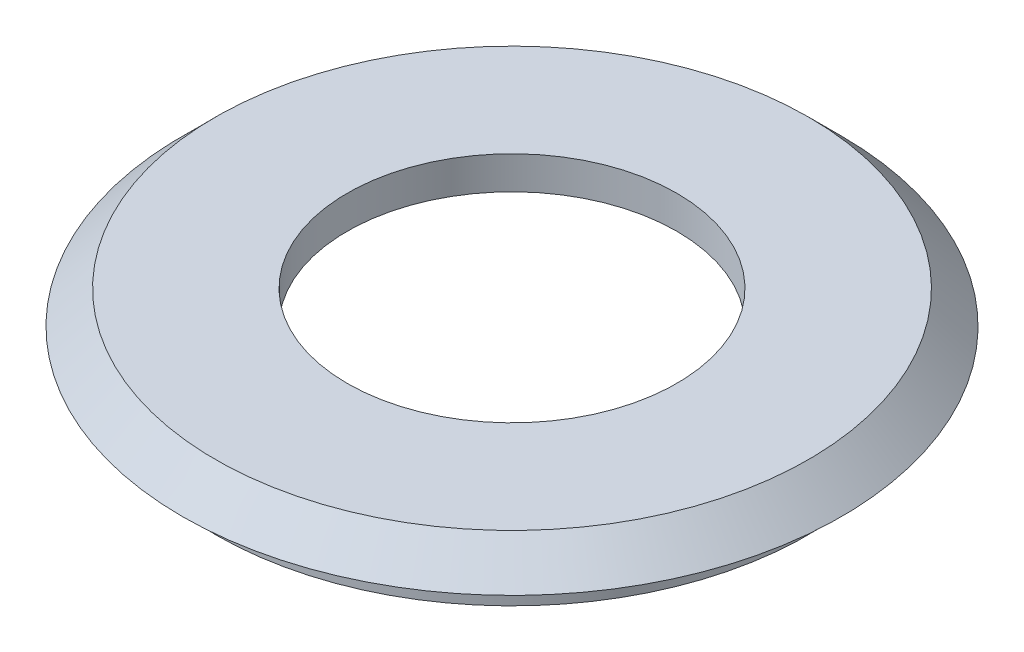
ISO-10303-21;
HEADER;
FILE_DESCRIPTION(('STEP AP214'),'2;1');
FILE_NAME('part.step','',(''),(''),'','','');
FILE_SCHEMA(('AUTOMOTIVE_DESIGN { 1 0 10303 214 1 1 1 1 }'));
ENDSEC;
DATA;
#1=APPLICATION_CONTEXT('core data for automotive mechanical design processes');
#2=APPLICATION_PROTOCOL_DEFINITION('international standard','automotive_design',2000,#1);
#3=PRODUCT_CONTEXT('',#1,'mechanical');
#4=PRODUCT('Part','Part','',(#3));
#5=PRODUCT_RELATED_PRODUCT_CATEGORY('part','',(#4));
#6=PRODUCT_DEFINITION_FORMATION('','',#4);
#7=PRODUCT_DEFINITION_CONTEXT('part definition',#1,'design');
#8=PRODUCT_DEFINITION('design','',#6,#7);
#9=PRODUCT_DEFINITION_SHAPE('','',#8);
#10=(LENGTH_UNIT() NAMED_UNIT(*) SI_UNIT(.MILLI.,.METRE.));
#11=(NAMED_UNIT(*) PLANE_ANGLE_UNIT() SI_UNIT($,.RADIAN.));
#12=(NAMED_UNIT(*) SI_UNIT($,.STERADIAN.) SOLID_ANGLE_UNIT());
#13=UNCERTAINTY_MEASURE_WITH_UNIT(LENGTH_MEASURE(1.E-05),#10,'distance_accuracy_value','');
#14=(GEOMETRIC_REPRESENTATION_CONTEXT(3) GLOBAL_UNCERTAINTY_ASSIGNED_CONTEXT((#13)) GLOBAL_UNIT_ASSIGNED_CONTEXT((#10,
#11,#12)) REPRESENTATION_CONTEXT('',''));
#15=CARTESIAN_POINT('',(0.,0.,0.));
#16=DIRECTION('',(0.,0.,1.));
#17=DIRECTION('',(1.,0.,0.));
#18=AXIS2_PLACEMENT_3D('',#15,#16,#17);
#19=CARTESIAN_POINT('',(0.,10.,0.));
#20=DIRECTION('',(0.,1.,0.));
#21=DIRECTION('',(0.,0.,1.));
#22=AXIS2_PLACEMENT_3D('',#19,#20,#21);
#23=PLANE('',#22);
#24=CARTESIAN_POINT('',(0.,10.,0.));
#25=DIRECTION('',(0.,1.,0.));
#26=DIRECTION('',(0.,0.,1.));
#27=AXIS2_PLACEMENT_3D('',#24,#25,#26);
#28=CIRCLE('',#27,50.);
#29=CARTESIAN_POINT('',(0.,10.,50.));
#30=VERTEX_POINT('',#29);
#31=EDGE_CURVE('E76',#30,#30,#28,.T.);
#32=ORIENTED_EDGE('',*,*,#31,.F.);
#33=EDGE_LOOP('',(#32));
#34=FACE_BOUND('',#33,.T.);
#35=CARTESIAN_POINT('',(0.,10.,0.));
#36=DIRECTION('',(0.,1.,0.));
#37=DIRECTION('',(0.,0.,1.));
#38=AXIS2_PLACEMENT_3D('',#35,#36,#37);
#39=CIRCLE('',#38,90.);
#40=CARTESIAN_POINT('',(0.,10.,-90.));
#41=VERTEX_POINT('',#40);
#42=EDGE_CURVE('E53',#41,#41,#39,.T.);
#43=ORIENTED_EDGE('',*,*,#42,.T.);
#44=EDGE_LOOP('',(#43));
#45=FACE_BOUND('',#44,.T.);
#46=ADVANCED_FACE('F43',(#34,#45),#23,.T.);
#47=CARTESIAN_POINT('',(0.,0.,0.));
#48=DIRECTION('',(0.,1.,0.));
#49=DIRECTION('',(0.,0.,1.));
#50=AXIS2_PLACEMENT_3D('',#47,#48,#49);
#51=PLANE('',#50);
#52=CARTESIAN_POINT('',(0.,0.,0.));
#53=DIRECTION('',(0.,1.,0.));
#54=DIRECTION('',(0.,0.,1.));
#55=AXIS2_PLACEMENT_3D('',#52,#53,#54);
#56=CIRCLE('',#55,89.75);
#57=CARTESIAN_POINT('',(0.,0.,89.75));
#58=VERTEX_POINT('',#57);
#59=EDGE_CURVE('E10',#58,#58,#56,.F.);
#60=ORIENTED_EDGE('',*,*,#59,.F.);
#61=EDGE_LOOP('',(#60));
#62=FACE_BOUND('',#61,.T.);
#63=CARTESIAN_POINT('',(0.,0.,0.));
#64=DIRECTION('',(0.,1.,0.));
#65=DIRECTION('',(0.,0.,1.));
#66=AXIS2_PLACEMENT_3D('',#63,#64,#65);
#67=CIRCLE('',#66,100.);
#68=CARTESIAN_POINT('',(0.,0.,-99.9999999999999));
#69=VERTEX_POINT('',#68);
#70=EDGE_CURVE('E58',#69,#69,#67,.T.);
#71=ORIENTED_EDGE('',*,*,#70,.F.);
#72=EDGE_LOOP('',(#71));
#73=FACE_BOUND('',#72,.T.);
#74=ADVANCED_FACE('F95',(#62,#73),#51,.F.);
#75=CARTESIAN_POINT('',(0.,10.,0.));
#76=DIRECTION('',(0.,-1.,0.));
#77=DIRECTION('',(0.,0.,-1.));
#78=AXIS2_PLACEMENT_3D('',#75,#76,#77);
#79=CONICAL_SURFACE('',#78,90.,0.785398163397445);
#80=CARTESIAN_POINT('',(0.,0.,-99.9999999999999));
#81=CARTESIAN_POINT('',(0.,0.104166666666667,-99.8958333333333));
#82=CARTESIAN_POINT('',(0.,0.208333333333334,-99.7916666666666));
#83=CARTESIAN_POINT('',(0.,0.416666666666667,-99.5833333333333));
#84=CARTESIAN_POINT('',(0.,0.520833333333333,-99.4791666666666));
#85=CARTESIAN_POINT('',(0.,0.729166666666668,-99.2708333333333));
#86=CARTESIAN_POINT('',(0.,0.833333333333336,-99.1666666666666));
#87=CARTESIAN_POINT('',(0.,1.04166666666667,-98.9583333333333));
#88=CARTESIAN_POINT('',(0.,1.14583333333333,-98.8541666666666));
#89=CARTESIAN_POINT('',(0.,1.35416666666666,-98.6458333333333));
#90=CARTESIAN_POINT('',(0.,1.45833333333333,-98.5416666666666));
#91=CARTESIAN_POINT('',(0.,1.66666666666667,-98.3333333333333));
#92=CARTESIAN_POINT('',(0.,1.77083333333333,-98.2291666666666));
#93=CARTESIAN_POINT('',(0.,1.97916666666667,-98.0208333333333));
#94=CARTESIAN_POINT('',(0.,2.08333333333333,-97.9166666666666));
#95=CARTESIAN_POINT('',(0.,2.29166666666667,-97.7083333333333));
#96=CARTESIAN_POINT('',(0.,2.39583333333333,-97.6041666666666));
#97=CARTESIAN_POINT('',(0.,2.60416666666667,-97.3958333333333));
#98=CARTESIAN_POINT('',(0.,2.70833333333333,-97.2916666666667));
#99=CARTESIAN_POINT('',(0.,2.91666666666667,-97.0833333333333));
#100=CARTESIAN_POINT('',(0.,3.02083333333333,-96.9791666666666));
#101=CARTESIAN_POINT('',(0.,3.22916666666666,-96.7708333333333));
#102=CARTESIAN_POINT('',(0.,3.33333333333333,-96.6666666666667));
#103=CARTESIAN_POINT('',(0.,3.54166666666667,-96.4583333333333));
#104=CARTESIAN_POINT('',(0.,3.64583333333333,-96.3541666666667));
#105=CARTESIAN_POINT('',(0.,3.85416666666667,-96.1458333333333));
#106=CARTESIAN_POINT('',(0.,3.95833333333333,-96.0416666666667));
#107=CARTESIAN_POINT('',(0.,4.16666666666667,-95.8333333333333));
#108=CARTESIAN_POINT('',(0.,4.27083333333333,-95.7291666666667));
#109=CARTESIAN_POINT('',(0.,4.47916666666667,-95.5208333333333));
#110=CARTESIAN_POINT('',(0.,4.58333333333333,-95.4166666666667));
#111=CARTESIAN_POINT('',(0.,4.79166666666667,-95.2083333333333));
#112=CARTESIAN_POINT('',(0.,4.89583333333333,-95.1041666666667));
#113=CARTESIAN_POINT('',(0.,5.10416666666667,-94.8958333333333));
#114=CARTESIAN_POINT('',(0.,5.20833333333333,-94.7916666666667));
#115=CARTESIAN_POINT('',(0.,5.41666666666667,-94.5833333333333));
#116=CARTESIAN_POINT('',(0.,5.52083333333333,-94.4791666666667));
#117=CARTESIAN_POINT('',(0.,5.72916666666667,-94.2708333333333));
#118=CARTESIAN_POINT('',(0.,5.83333333333333,-94.1666666666667));
#119=CARTESIAN_POINT('',(0.,6.04166666666666,-93.9583333333333));
#120=CARTESIAN_POINT('',(0.,6.14583333333333,-93.8541666666667));
#121=CARTESIAN_POINT('',(0.,6.35416666666667,-93.6458333333333));
#122=CARTESIAN_POINT('',(0.,6.45833333333333,-93.5416666666667));
#123=CARTESIAN_POINT('',(0.,6.66666666666667,-93.3333333333333));
#124=CARTESIAN_POINT('',(0.,6.77083333333333,-93.2291666666667));
#125=CARTESIAN_POINT('',(0.,6.97916666666667,-93.0208333333333));
#126=CARTESIAN_POINT('',(0.,7.08333333333333,-92.9166666666667));
#127=CARTESIAN_POINT('',(0.,7.29166666666667,-92.7083333333333));
#128=CARTESIAN_POINT('',(0.,7.39583333333333,-92.6041666666667));
#129=CARTESIAN_POINT('',(0.,7.60416666666667,-92.3958333333333));
#130=CARTESIAN_POINT('',(0.,7.70833333333333,-92.2916666666667));
#131=CARTESIAN_POINT('',(0.,7.91666666666666,-92.0833333333333));
#132=CARTESIAN_POINT('',(0.,8.02083333333333,-91.9791666666667));
#133=CARTESIAN_POINT('',(0.,8.22916666666667,-91.7708333333333));
#134=CARTESIAN_POINT('',(0.,8.33333333333333,-91.6666666666667));
#135=CARTESIAN_POINT('',(0.,8.54166666666667,-91.4583333333333));
#136=CARTESIAN_POINT('',(0.,8.64583333333333,-91.3541666666667));
#137=CARTESIAN_POINT('',(0.,8.85416666666666,-91.1458333333333));
#138=CARTESIAN_POINT('',(0.,8.95833333333333,-91.0416666666667));
#139=CARTESIAN_POINT('',(0.,9.16666666666666,-90.8333333333333));
#140=CARTESIAN_POINT('',(0.,9.27083333333333,-90.7291666666667));
#141=CARTESIAN_POINT('',(0.,9.47916666666667,-90.5208333333334));
#142=CARTESIAN_POINT('',(0.,9.58333333333333,-90.4166666666667));
#143=CARTESIAN_POINT('',(0.,9.79166666666666,-90.2083333333333));
#144=CARTESIAN_POINT('',(0.,9.89583333333333,-90.1041666666667));
#145=CARTESIAN_POINT('',(0.,10.,-90.));
#146=B_SPLINE_CURVE_WITH_KNOTS('',3,(#80,#81,#82,#83,#84,#85,#86,#87,#88,#89,#90,#91,#92,#93,
#94,#95,#96,#97,#98,#99,#100,#101,#102,#103,#104,#105,#106,#107,#108,#109,#110,#111,#112,#113,
#114,#115,#116,#117,#118,#119,#120,#121,#122,#123,#124,#125,#126,#127,#128,#129,#130,#131,#132,
#133,#134,#135,#136,#137,#138,#139,#140,#141,#142,#143,#144,#145),.UNSPECIFIED.,.F.,.F.,(4,2,2,
2,2,2,2,2,2,2,2,2,2,2,2,2,2,2,2,2,2,2,2,2,2,2,2,2,2,2,2,2,4),(0.,0.441941738241588,
0.883883476483175,1.32582521472476,1.76776695296636,2.20970869120795,2.65165042944953,
3.09359216769113,3.53553390593272,3.97747564417431,4.4194173824159,4.86135912065749,
5.30330085889908,5.74524259714068,6.18718433538226,6.62912607362385,7.07106781186545,
7.51300955010704,7.95495128834862,8.39689302659022,8.83883476483181,9.2807765030734,
9.72271824131499,10.1646599795566,10.6066017177982,11.0485434560398,11.4904851942814,
11.9324269325229,12.3743686707645,12.8163104090061,13.2582521472477,13.7001938854893,
14.1421356237309),.UNSPECIFIED.);
#147=EDGE_CURVE('BSEAM46',#69,#41,#146,.T.);
#148=ORIENTED_EDGE('',*,*,#70,.T.);
#149=ORIENTED_EDGE('',*,*,#42,.F.);
#150=ORIENTED_EDGE('',*,*,#147,.T.);
#151=ORIENTED_EDGE('',*,*,#147,.F.);
#152=EDGE_LOOP('',(#148,#150,#149,#151));
#153=FACE_BOUND('',#152,.T.);
#154=ADVANCED_FACE('F46',(#153),#79,.T.);
#155=CARTESIAN_POINT('',(0.,-10.,0.));
#156=DIRECTION('',(0.,-1.,0.));
#157=DIRECTION('',(0.,0.,-1.));
#158=AXIS2_PLACEMENT_3D('',#155,#156,#157);
#159=PLANE('',#158);
#160=CARTESIAN_POINT('',(0.,-10.,0.));
#161=DIRECTION('',(0.,-1.,0.));
#162=DIRECTION('',(0.,0.,-1.));
#163=AXIS2_PLACEMENT_3D('',#160,#161,#162);
#164=CIRCLE('',#163,89.75);
#165=CARTESIAN_POINT('',(0.,-10.,-89.75));
#166=VERTEX_POINT('',#165);
#167=EDGE_CURVE('E64',#166,#166,#164,.T.);
#168=ORIENTED_EDGE('',*,*,#167,.T.);
#169=EDGE_LOOP('',(#168));
#170=FACE_BOUND('',#169,.T.);
#171=CARTESIAN_POINT('',(0.,-10.,0.));
#172=DIRECTION('',(0.,-1.,0.));
#173=DIRECTION('',(0.,0.,-1.));
#174=AXIS2_PLACEMENT_3D('',#171,#172,#173);
#175=CIRCLE('',#174,85.);
#176=CARTESIAN_POINT('',(0.,-10.,-85.));
#177=VERTEX_POINT('',#176);
#178=EDGE_CURVE('E68',#177,#177,#175,.T.);
#179=ORIENTED_EDGE('',*,*,#178,.F.);
#180=EDGE_LOOP('',(#179));
#181=FACE_BOUND('',#180,.T.);
#182=ADVANCED_FACE('F109',(#170,#181),#159,.T.);
#183=CARTESIAN_POINT('',(0.,-10.,0.));
#184=DIRECTION('',(0.,1.,0.));
#185=DIRECTION('',(0.,0.,1.));
#186=AXIS2_PLACEMENT_3D('',#183,#184,#185);
#187=CYLINDRICAL_SURFACE('',#186,89.75);
#188=ORIENTED_EDGE('',*,*,#167,.F.);
#189=EDGE_LOOP('',(#188));
#190=FACE_BOUND('',#189,.T.);
#191=ORIENTED_EDGE('',*,*,#59,.T.);
#192=EDGE_LOOP('',(#191));
#193=FACE_BOUND('',#192,.T.);
#194=ADVANCED_FACE('F106',(#190,#193),#187,.T.);
#195=CARTESIAN_POINT('',(0.,-10.,0.));
#196=DIRECTION('',(0.,1.,0.));
#197=DIRECTION('',(0.,0.,1.));
#198=AXIS2_PLACEMENT_3D('',#195,#196,#197);
#199=CYLINDRICAL_SURFACE('',#198,85.);
#200=ORIENTED_EDGE('',*,*,#178,.T.);
#201=EDGE_LOOP('',(#200));
#202=FACE_BOUND('',#201,.T.);
#203=CARTESIAN_POINT('',(0.,0.,0.));
#204=DIRECTION('',(0.,-1.,0.));
#205=DIRECTION('',(0.,0.,-1.));
#206=AXIS2_PLACEMENT_3D('',#203,#204,#205);
#207=CIRCLE('',#206,85.);
#208=CARTESIAN_POINT('',(0.,0.,-85.));
#209=VERTEX_POINT('',#208);
#210=EDGE_CURVE('E69',#209,#209,#207,.T.);
#211=ORIENTED_EDGE('',*,*,#210,.F.);
#212=EDGE_LOOP('',(#211));
#213=FACE_BOUND('',#212,.T.);
#214=ADVANCED_FACE('F94',(#202,#213),#199,.F.);
#215=CARTESIAN_POINT('',(0.,0.,0.));
#216=DIRECTION('',(0.,1.,0.));
#217=DIRECTION('',(0.,0.,1.));
#218=AXIS2_PLACEMENT_3D('',#215,#216,#217);
#219=CIRCLE('',#218,50.);
#220=CARTESIAN_POINT('',(0.,0.,50.));
#221=VERTEX_POINT('',#220);
#222=EDGE_CURVE('E48',#221,#221,#219,.T.);
#223=ORIENTED_EDGE('',*,*,#222,.T.);
#224=EDGE_LOOP('',(#223));
#225=FACE_BOUND('',#224,.T.);
#226=ORIENTED_EDGE('',*,*,#210,.T.);
#227=EDGE_LOOP('',(#226));
#228=FACE_BOUND('',#227,.T.);
#229=ADVANCED_FACE('F85',(#225,#228),#51,.F.);
#230=CARTESIAN_POINT('',(0.,-10.,0.));
#231=DIRECTION('',(0.,1.,0.));
#232=DIRECTION('',(0.,0.,1.));
#233=AXIS2_PLACEMENT_3D('',#230,#231,#232);
#234=CYLINDRICAL_SURFACE('',#233,50.);
#235=ORIENTED_EDGE('',*,*,#31,.T.);
#236=EDGE_LOOP('',(#235));
#237=FACE_BOUND('',#236,.T.);
#238=ORIENTED_EDGE('',*,*,#222,.F.);
#239=EDGE_LOOP('',(#238));
#240=FACE_BOUND('',#239,.T.);
#241=ADVANCED_FACE('F88',(#237,#240),#234,.F.);
#242=CLOSED_SHELL('',(#46,#74,#154,#182,#194,#214,#229,#241));
#243=MANIFOLD_SOLID_BREP('B2',#242);
#244=ADVANCED_BREP_SHAPE_REPRESENTATION('',(#18,#243),#14);
#245=SHAPE_DEFINITION_REPRESENTATION(#9,#244);
ENDSEC;
END-ISO-10303-21;
